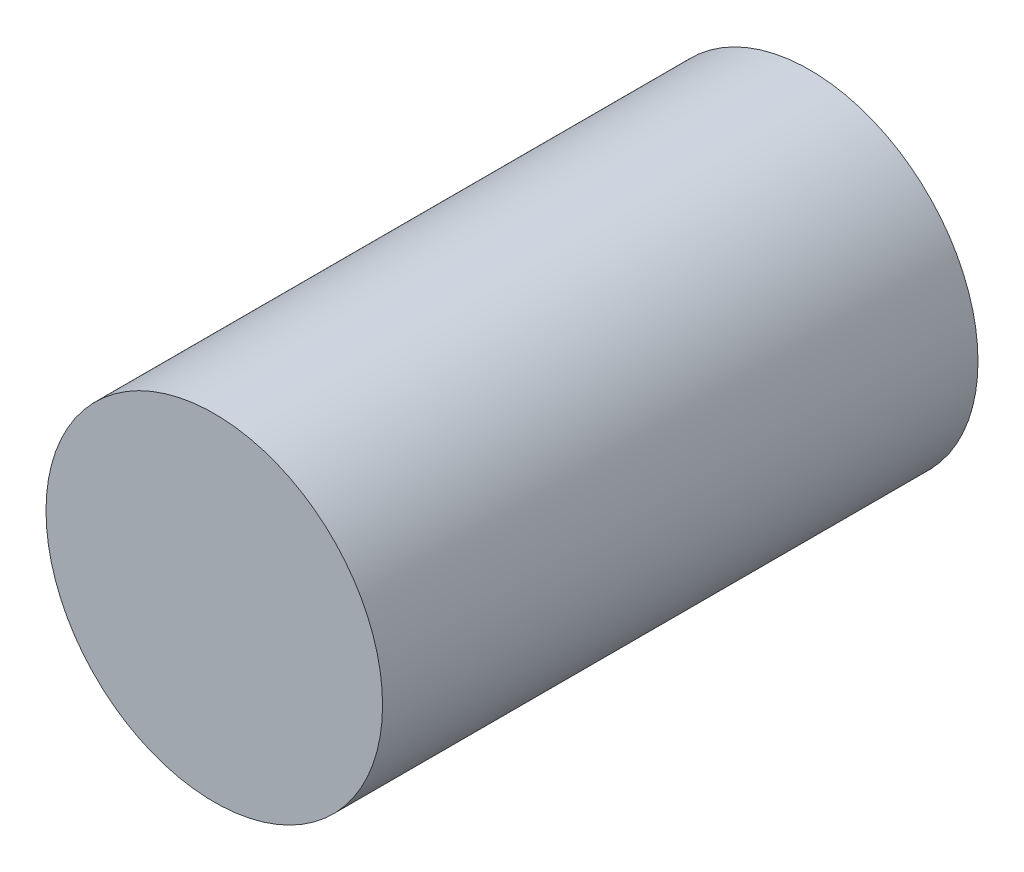
ISO-10303-21;
HEADER;
FILE_DESCRIPTION(('STEP AP214'),'2;1');
FILE_NAME('part.step','',(''),(''),'','','');
FILE_SCHEMA(('AUTOMOTIVE_DESIGN { 1 0 10303 214 1 1 1 1 }'));
ENDSEC;
DATA;
#1=APPLICATION_CONTEXT('core data for automotive mechanical design processes');
#2=APPLICATION_PROTOCOL_DEFINITION('international standard','automotive_design',2000,#1);
#3=PRODUCT_CONTEXT('',#1,'mechanical');
#4=PRODUCT('Part','Part','',(#3));
#5=PRODUCT_RELATED_PRODUCT_CATEGORY('part','',(#4));
#6=PRODUCT_DEFINITION_FORMATION('','',#4);
#7=PRODUCT_DEFINITION_CONTEXT('part definition',#1,'design');
#8=PRODUCT_DEFINITION('design','',#6,#7);
#9=PRODUCT_DEFINITION_SHAPE('','',#8);
#10=(LENGTH_UNIT() NAMED_UNIT(*) SI_UNIT(.MILLI.,.METRE.));
#11=(NAMED_UNIT(*) PLANE_ANGLE_UNIT() SI_UNIT($,.RADIAN.));
#12=(NAMED_UNIT(*) SI_UNIT($,.STERADIAN.) SOLID_ANGLE_UNIT());
#13=UNCERTAINTY_MEASURE_WITH_UNIT(LENGTH_MEASURE(1.E-05),#10,'distance_accuracy_value','');
#14=(GEOMETRIC_REPRESENTATION_CONTEXT(3) GLOBAL_UNCERTAINTY_ASSIGNED_CONTEXT((#13)) GLOBAL_UNIT_ASSIGNED_CONTEXT((#10,
#11,#12)) REPRESENTATION_CONTEXT('',''));
#15=CARTESIAN_POINT('',(0.,0.,0.));
#16=DIRECTION('',(0.,0.,1.));
#17=DIRECTION('',(1.,0.,0.));
#18=AXIS2_PLACEMENT_3D('',#15,#16,#17);
#19=CARTESIAN_POINT('',(0.,0.,13.8));
#20=DIRECTION('',(0.,0.,-1.));
#21=DIRECTION('',(-1.,0.,0.));
#22=AXIS2_PLACEMENT_3D('',#19,#20,#21);
#23=CYLINDRICAL_SURFACE('',#22,3.9);
#24=CARTESIAN_POINT('',(0.,0.,13.8));
#25=DIRECTION('',(0.,0.,1.));
#26=DIRECTION('',(1.,0.,0.));
#27=AXIS2_PLACEMENT_3D('',#24,#25,#26);
#28=CIRCLE('',#27,3.9);
#29=CARTESIAN_POINT('',(-3.9,0.,13.8));
#30=VERTEX_POINT('',#29);
#31=EDGE_CURVE('E10',#30,#30,#28,.T.);
#32=CARTESIAN_POINT('',(0.,0.,0.));
#33=DIRECTION('',(0.,0.,1.));
#34=DIRECTION('',(1.,0.,0.));
#35=AXIS2_PLACEMENT_3D('',#32,#33,#34);
#36=CIRCLE('',#35,3.9);
#37=CARTESIAN_POINT('',(-3.9,0.,0.));
#38=VERTEX_POINT('',#37);
#39=EDGE_CURVE('E37',#38,#38,#36,.T.);
#40=CARTESIAN_POINT('',(-3.9,0.,13.8));
#41=CARTESIAN_POINT('',(-3.9,0.,13.65625));
#42=CARTESIAN_POINT('',(-3.9,0.,13.5125));
#43=CARTESIAN_POINT('',(-3.9,0.,13.225));
#44=CARTESIAN_POINT('',(-3.9,0.,13.08125));
#45=CARTESIAN_POINT('',(-3.9,0.,12.79375));
#46=CARTESIAN_POINT('',(-3.9,0.,12.65));
#47=CARTESIAN_POINT('',(-3.9,0.,12.3625));
#48=CARTESIAN_POINT('',(-3.9,0.,12.21875));
#49=CARTESIAN_POINT('',(-3.9,0.,11.93125));
#50=CARTESIAN_POINT('',(-3.9,0.,11.7875));
#51=CARTESIAN_POINT('',(-3.9,0.,11.5));
#52=CARTESIAN_POINT('',(-3.9,0.,11.35625));
#53=CARTESIAN_POINT('',(-3.9,0.,11.06875));
#54=CARTESIAN_POINT('',(-3.9,0.,10.925));
#55=CARTESIAN_POINT('',(-3.9,0.,10.6375));
#56=CARTESIAN_POINT('',(-3.9,0.,10.49375));
#57=CARTESIAN_POINT('',(-3.9,0.,10.20625));
#58=CARTESIAN_POINT('',(-3.9,0.,10.0625));
#59=CARTESIAN_POINT('',(-3.9,0.,9.775));
#60=CARTESIAN_POINT('',(-3.9,0.,9.63125));
#61=CARTESIAN_POINT('',(-3.9,0.,9.34375));
#62=CARTESIAN_POINT('',(-3.9,0.,9.2));
#63=CARTESIAN_POINT('',(-3.9,0.,8.9125));
#64=CARTESIAN_POINT('',(-3.9,0.,8.76875));
#65=CARTESIAN_POINT('',(-3.9,0.,8.48125));
#66=CARTESIAN_POINT('',(-3.9,0.,8.3375));
#67=CARTESIAN_POINT('',(-3.9,0.,8.05));
#68=CARTESIAN_POINT('',(-3.9,0.,7.90625));
#69=CARTESIAN_POINT('',(-3.9,0.,7.61875));
#70=CARTESIAN_POINT('',(-3.9,0.,7.475));
#71=CARTESIAN_POINT('',(-3.9,0.,7.1875));
#72=CARTESIAN_POINT('',(-3.9,0.,7.04375));
#73=CARTESIAN_POINT('',(-3.9,0.,6.75625));
#74=CARTESIAN_POINT('',(-3.9,0.,6.6125));
#75=CARTESIAN_POINT('',(-3.9,0.,6.325));
#76=CARTESIAN_POINT('',(-3.9,0.,6.18125));
#77=CARTESIAN_POINT('',(-3.9,0.,5.89375));
#78=CARTESIAN_POINT('',(-3.9,0.,5.75));
#79=CARTESIAN_POINT('',(-3.9,0.,5.4625));
#80=CARTESIAN_POINT('',(-3.9,0.,5.31875));
#81=CARTESIAN_POINT('',(-3.9,0.,5.03125));
#82=CARTESIAN_POINT('',(-3.9,0.,4.8875));
#83=CARTESIAN_POINT('',(-3.9,0.,4.6));
#84=CARTESIAN_POINT('',(-3.9,0.,4.45625));
#85=CARTESIAN_POINT('',(-3.9,0.,4.16875));
#86=CARTESIAN_POINT('',(-3.9,0.,4.025));
#87=CARTESIAN_POINT('',(-3.9,0.,3.7375));
#88=CARTESIAN_POINT('',(-3.9,0.,3.59375));
#89=CARTESIAN_POINT('',(-3.9,0.,3.30625));
#90=CARTESIAN_POINT('',(-3.9,0.,3.1625));
#91=CARTESIAN_POINT('',(-3.9,0.,2.875));
#92=CARTESIAN_POINT('',(-3.9,0.,2.73125));
#93=CARTESIAN_POINT('',(-3.9,0.,2.44375));
#94=CARTESIAN_POINT('',(-3.9,0.,2.3));
#95=CARTESIAN_POINT('',(-3.9,0.,2.0125));
#96=CARTESIAN_POINT('',(-3.9,0.,1.86875));
#97=CARTESIAN_POINT('',(-3.9,0.,1.58125));
#98=CARTESIAN_POINT('',(-3.9,0.,1.4375));
#99=CARTESIAN_POINT('',(-3.9,0.,1.15));
#100=CARTESIAN_POINT('',(-3.9,0.,1.00625));
#101=CARTESIAN_POINT('',(-3.9,0.,0.71875));
#102=CARTESIAN_POINT('',(-3.9,0.,0.575));
#103=CARTESIAN_POINT('',(-3.9,0.,0.2875));
#104=CARTESIAN_POINT('',(-3.9,0.,0.14375));
#105=CARTESIAN_POINT('',(-3.9,0.,0.));
#106=B_SPLINE_CURVE_WITH_KNOTS('',3,(#40,#41,#42,#43,#44,#45,#46,#47,#48,#49,#50,#51,#52,#53,
#54,#55,#56,#57,#58,#59,#60,#61,#62,#63,#64,#65,#66,#67,#68,#69,#70,#71,#72,#73,#74,#75,#76,#77,
#78,#79,#80,#81,#82,#83,#84,#85,#86,#87,#88,#89,#90,#91,#92,#93,#94,#95,#96,#97,#98,#99,#100,
#101,#102,#103,#104,#105),.UNSPECIFIED.,.F.,.F.,(4,2,2,2,2,2,2,2,2,2,2,2,2,2,2,2,2,2,2,2,2,2,2,
2,2,2,2,2,2,2,2,2,4),(0.,0.431250000000001,0.8625,1.29375,1.725,2.15625,2.5875,3.01875,3.45,
3.88125,4.3125,4.74375,5.175,5.60625,6.0375,6.46875,6.9,7.33125,7.7625,8.19375,8.625,9.05625,
9.4875,9.91875,10.35,10.78125,11.2125,11.64375,12.075,12.50625,12.9375,13.36875,13.8),.UNSPECIFIED.);
#107=EDGE_CURVE('BSEAM40',#30,#38,#106,.T.);
#108=ORIENTED_EDGE('',*,*,#31,.F.);
#109=ORIENTED_EDGE('',*,*,#39,.T.);
#110=ORIENTED_EDGE('',*,*,#107,.T.);
#111=ORIENTED_EDGE('',*,*,#107,.F.);
#112=EDGE_LOOP('',(#108,#110,#109,#111));
#113=FACE_BOUND('',#112,.T.);
#114=ADVANCED_FACE('F40',(#113),#23,.T.);
#115=CARTESIAN_POINT('',(0.,0.,13.8));
#116=DIRECTION('',(0.,0.,1.));
#117=DIRECTION('',(1.,0.,0.));
#118=AXIS2_PLACEMENT_3D('',#115,#116,#117);
#119=PLANE('',#118);
#120=ORIENTED_EDGE('',*,*,#31,.T.);
#121=EDGE_LOOP('',(#120));
#122=FACE_BOUND('',#121,.T.);
#123=ADVANCED_FACE('F55',(#122),#119,.T.);
#124=CARTESIAN_POINT('',(0.,0.,0.));
#125=DIRECTION('',(0.,0.,1.));
#126=DIRECTION('',(1.,0.,0.));
#127=AXIS2_PLACEMENT_3D('',#124,#125,#126);
#128=PLANE('',#127);
#129=ORIENTED_EDGE('',*,*,#39,.F.);
#130=EDGE_LOOP('',(#129));
#131=FACE_BOUND('',#130,.T.);
#132=ADVANCED_FACE('F49',(#131),#128,.F.);
#133=CLOSED_SHELL('',(#114,#123,#132));
#134=MANIFOLD_SOLID_BREP('B2',#133);
#135=ADVANCED_BREP_SHAPE_REPRESENTATION('',(#18,#134),#14);
#136=SHAPE_DEFINITION_REPRESENTATION(#9,#135);
ENDSEC;
END-ISO-10303-21;
